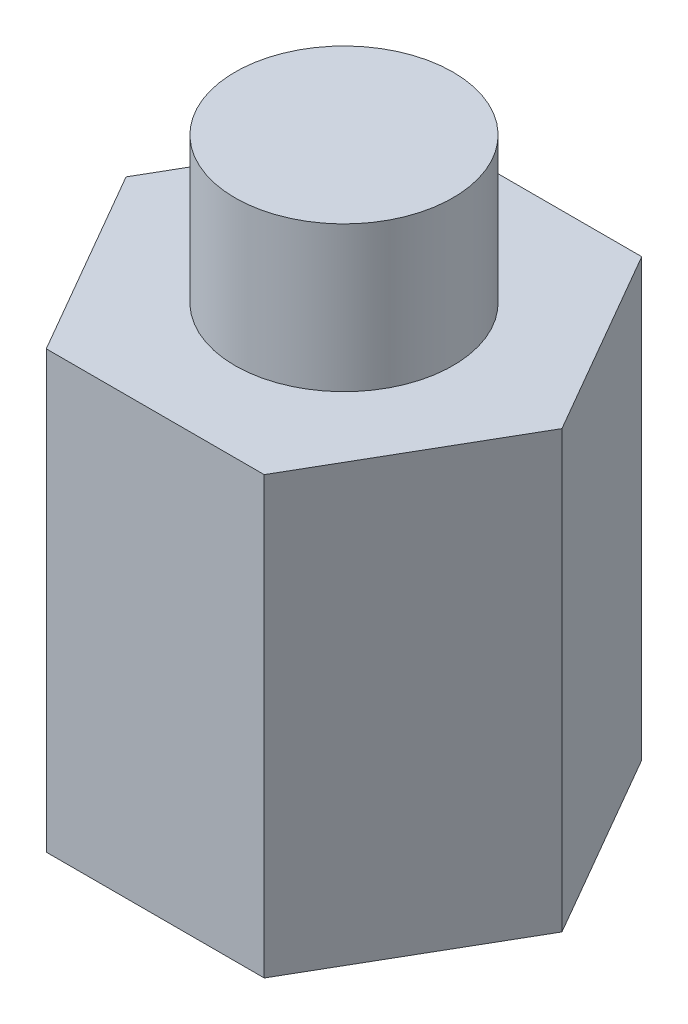
ISO-10303-21;
HEADER;
FILE_DESCRIPTION(('STEP AP214'),'2;1');
FILE_NAME('part.step','',(''),(''),'','','');
FILE_SCHEMA(('AUTOMOTIVE_DESIGN { 1 0 10303 214 1 1 1 1 }'));
ENDSEC;
DATA;
#1=APPLICATION_CONTEXT('core data for automotive mechanical design processes');
#2=APPLICATION_PROTOCOL_DEFINITION('international standard','automotive_design',2000,#1);
#3=PRODUCT_CONTEXT('',#1,'mechanical');
#4=PRODUCT('Part','Part','',(#3));
#5=PRODUCT_RELATED_PRODUCT_CATEGORY('part','',(#4));
#6=PRODUCT_DEFINITION_FORMATION('','',#4);
#7=PRODUCT_DEFINITION_CONTEXT('part definition',#1,'design');
#8=PRODUCT_DEFINITION('design','',#6,#7);
#9=PRODUCT_DEFINITION_SHAPE('','',#8);
#10=(LENGTH_UNIT() NAMED_UNIT(*) SI_UNIT(.MILLI.,.METRE.));
#11=(NAMED_UNIT(*) PLANE_ANGLE_UNIT() SI_UNIT($,.RADIAN.));
#12=(NAMED_UNIT(*) SI_UNIT($,.STERADIAN.) SOLID_ANGLE_UNIT());
#13=UNCERTAINTY_MEASURE_WITH_UNIT(LENGTH_MEASURE(1.E-05),#10,'distance_accuracy_value','');
#14=(GEOMETRIC_REPRESENTATION_CONTEXT(3) GLOBAL_UNCERTAINTY_ASSIGNED_CONTEXT((#13)) GLOBAL_UNIT_ASSIGNED_CONTEXT((#10,
#11,#12)) REPRESENTATION_CONTEXT('',''));
#15=CARTESIAN_POINT('',(0.,0.,0.));
#16=DIRECTION('',(0.,0.,1.));
#17=DIRECTION('',(1.,0.,0.));
#18=AXIS2_PLACEMENT_3D('',#15,#16,#17);
#19=CARTESIAN_POINT('',(0.,6.,0.));
#20=DIRECTION('',(0.,-1.,0.));
#21=DIRECTION('',(0.,0.,-1.));
#22=AXIS2_PLACEMENT_3D('',#19,#20,#21);
#23=CYLINDRICAL_SURFACE('',#22,1.5);
#24=CARTESIAN_POINT('',(0.,0.,0.));
#25=DIRECTION('',(0.,1.,0.));
#26=DIRECTION('',(0.,0.,1.));
#27=AXIS2_PLACEMENT_3D('',#24,#25,#26);
#28=CIRCLE('',#27,1.5);
#29=CARTESIAN_POINT('',(0.,0.,1.5));
#30=VERTEX_POINT('',#29);
#31=EDGE_CURVE('E262',#30,#30,#28,.T.);
#32=ORIENTED_EDGE('',*,*,#31,.F.);
#33=EDGE_LOOP('',(#32));
#34=FACE_BOUND('',#33,.T.);
#35=CARTESIAN_POINT('',(0.,5.,0.));
#36=DIRECTION('',(0.,1.,0.));
#37=DIRECTION('',(0.,0.,1.));
#38=AXIS2_PLACEMENT_3D('',#35,#36,#37);
#39=CIRCLE('',#38,1.5);
#40=CARTESIAN_POINT('',(0.,5.,1.5));
#41=VERTEX_POINT('',#40);
#42=EDGE_CURVE('E258',#41,#41,#39,.T.);
#43=ORIENTED_EDGE('',*,*,#42,.T.);
#44=EDGE_LOOP('',(#43));
#45=FACE_BOUND('',#44,.T.);
#46=ADVANCED_FACE('F45',(#34,#45),#23,.F.);
#47=CARTESIAN_POINT('',(0.,6.,0.));
#48=DIRECTION('',(0.,1.,0.));
#49=DIRECTION('',(0.,0.,1.));
#50=AXIS2_PLACEMENT_3D('',#47,#48,#49);
#51=PLANE('',#50);
#52=DIRECTION('',(0.5,0.,-0.866025403784439));
#53=VECTOR('',#52,1.);
#54=CARTESIAN_POINT('',(1.5,6.,2.59807621135332));
#55=LINE('',#54,#53);
#56=CARTESIAN_POINT('',(1.5,6.,2.59807621135332));
#57=VERTEX_POINT('',#56);
#58=CARTESIAN_POINT('',(3.,6.,0.));
#59=VERTEX_POINT('',#58);
#60=EDGE_CURVE('E153',#57,#59,#55,.T.);
#61=ORIENTED_EDGE('',*,*,#60,.T.);
#62=DIRECTION('',(-0.5,0.,-0.866025403784438));
#63=VECTOR('',#62,1.);
#64=CARTESIAN_POINT('',(3.,6.,0.));
#65=LINE('',#64,#63);
#66=CARTESIAN_POINT('',(1.5,6.,-2.59807621135331));
#67=VERTEX_POINT('',#66);
#68=EDGE_CURVE('E100',#59,#67,#65,.T.);
#69=ORIENTED_EDGE('',*,*,#68,.T.);
#70=DIRECTION('',(-1.,0.,0.));
#71=VECTOR('',#70,1.);
#72=CARTESIAN_POINT('',(1.5,6.,-2.59807621135331));
#73=LINE('',#72,#71);
#74=CARTESIAN_POINT('',(-1.5,6.,-2.59807621135332));
#75=VERTEX_POINT('',#74);
#76=EDGE_CURVE('E114',#67,#75,#73,.T.);
#77=ORIENTED_EDGE('',*,*,#76,.T.);
#78=DIRECTION('',(-0.5,0.,0.866025403784439));
#79=VECTOR('',#78,1.);
#80=CARTESIAN_POINT('',(-1.5,6.,-2.59807621135332));
#81=LINE('',#80,#79);
#82=CARTESIAN_POINT('',(-3.,6.,0.));
#83=VERTEX_POINT('',#82);
#84=EDGE_CURVE('E107',#75,#83,#81,.T.);
#85=ORIENTED_EDGE('',*,*,#84,.T.);
#86=DIRECTION('',(0.5,0.,0.866025403784439));
#87=VECTOR('',#86,1.);
#88=CARTESIAN_POINT('',(-3.,6.,0.));
#89=LINE('',#88,#87);
#90=CARTESIAN_POINT('',(-1.5,6.,2.59807621135332));
#91=VERTEX_POINT('',#90);
#92=EDGE_CURVE('E112',#83,#91,#89,.T.);
#93=ORIENTED_EDGE('',*,*,#92,.T.);
#94=DIRECTION('',(1.,0.,0.));
#95=VECTOR('',#94,1.);
#96=CARTESIAN_POINT('',(-1.5,6.,2.59807621135332));
#97=LINE('',#96,#95);
#98=EDGE_CURVE('E63',#91,#57,#97,.T.);
#99=ORIENTED_EDGE('',*,*,#98,.T.);
#100=EDGE_LOOP('',(#61,#69,#77,#85,#93,#99));
#101=FACE_BOUND('',#100,.T.);
#102=CARTESIAN_POINT('',(0.,6.,0.));
#103=DIRECTION('',(0.,1.,0.));
#104=DIRECTION('',(0.,0.,1.));
#105=AXIS2_PLACEMENT_3D('',#102,#103,#104);
#106=CIRCLE('',#105,1.5);
#107=CARTESIAN_POINT('',(0.,6.,1.5));
#108=VERTEX_POINT('',#107);
#109=EDGE_CURVE('E141',#108,#108,#106,.T.);
#110=ORIENTED_EDGE('',*,*,#109,.F.);
#111=EDGE_LOOP('',(#110));
#112=FACE_BOUND('',#111,.T.);
#113=ADVANCED_FACE('F109',(#101,#112),#51,.T.);
#114=CARTESIAN_POINT('',(0.,0.,0.));
#115=DIRECTION('',(0.,1.,0.));
#116=DIRECTION('',(0.,0.,1.));
#117=AXIS2_PLACEMENT_3D('',#114,#115,#116);
#118=PLANE('',#117);
#119=DIRECTION('',(0.5,0.,-0.866025403784439));
#120=VECTOR('',#119,1.);
#121=CARTESIAN_POINT('',(1.5,0.,2.59807621135332));
#122=LINE('',#121,#120);
#123=CARTESIAN_POINT('',(1.5,0.,2.59807621135332));
#124=VERTEX_POINT('',#123);
#125=CARTESIAN_POINT('',(3.,0.,0.));
#126=VERTEX_POINT('',#125);
#127=EDGE_CURVE('E136',#124,#126,#122,.T.);
#128=ORIENTED_EDGE('',*,*,#127,.F.);
#129=DIRECTION('',(1.,0.,0.));
#130=VECTOR('',#129,1.);
#131=CARTESIAN_POINT('',(-1.5,0.,2.59807621135332));
#132=LINE('',#131,#130);
#133=CARTESIAN_POINT('',(-1.5,0.,2.59807621135332));
#134=VERTEX_POINT('',#133);
#135=EDGE_CURVE('E92',#134,#124,#132,.T.);
#136=ORIENTED_EDGE('',*,*,#135,.F.);
#137=DIRECTION('',(0.5,0.,0.866025403784439));
#138=VECTOR('',#137,1.);
#139=CARTESIAN_POINT('',(-3.,0.,0.));
#140=LINE('',#139,#138);
#141=CARTESIAN_POINT('',(-3.,0.,0.));
#142=VERTEX_POINT('',#141);
#143=EDGE_CURVE('E86',#142,#134,#140,.T.);
#144=ORIENTED_EDGE('',*,*,#143,.F.);
#145=DIRECTION('',(-0.5,0.,0.866025403784439));
#146=VECTOR('',#145,1.);
#147=CARTESIAN_POINT('',(-1.5,0.,-2.59807621135332));
#148=LINE('',#147,#146);
#149=CARTESIAN_POINT('',(-1.5,0.,-2.59807621135332));
#150=VERTEX_POINT('',#149);
#151=EDGE_CURVE('E123',#150,#142,#148,.T.);
#152=ORIENTED_EDGE('',*,*,#151,.F.);
#153=DIRECTION('',(-1.,0.,0.));
#154=VECTOR('',#153,1.);
#155=CARTESIAN_POINT('',(1.5,0.,-2.59807621135331));
#156=LINE('',#155,#154);
#157=CARTESIAN_POINT('',(1.5,0.,-2.59807621135331));
#158=VERTEX_POINT('',#157);
#159=EDGE_CURVE('E144',#158,#150,#156,.T.);
#160=ORIENTED_EDGE('',*,*,#159,.F.);
#161=DIRECTION('',(-0.5,0.,-0.866025403784438));
#162=VECTOR('',#161,1.);
#163=CARTESIAN_POINT('',(3.,0.,0.));
#164=LINE('',#163,#162);
#165=EDGE_CURVE('E140',#126,#158,#164,.T.);
#166=ORIENTED_EDGE('',*,*,#165,.F.);
#167=EDGE_LOOP('',(#128,#136,#144,#152,#160,#166));
#168=FACE_BOUND('',#167,.T.);
#169=ORIENTED_EDGE('',*,*,#31,.T.);
#170=EDGE_LOOP('',(#169));
#171=FACE_BOUND('',#170,.T.);
#172=ADVANCED_FACE('F166',(#168,#171),#118,.F.);
#173=CARTESIAN_POINT('',(1.5,6.,2.59807621135332));
#174=DIRECTION('',(-0.866025403784439,0.,-0.499999999999999));
#175=DIRECTION('',(-0.5,0.,0.866025403784439));
#176=AXIS2_PLACEMENT_3D('',#173,#174,#175);
#177=PLANE('',#176);
#178=ORIENTED_EDGE('',*,*,#127,.T.);
#179=DIRECTION('',(0.,-1.,0.));
#180=VECTOR('',#179,1.);
#181=CARTESIAN_POINT('',(3.,6.,0.));
#182=LINE('',#181,#180);
#183=EDGE_CURVE('E11',#59,#126,#182,.T.);
#184=ORIENTED_EDGE('',*,*,#183,.F.);
#185=ORIENTED_EDGE('',*,*,#60,.F.);
#186=DIRECTION('',(0.,-1.,0.));
#187=VECTOR('',#186,1.);
#188=CARTESIAN_POINT('',(1.5,6.,2.59807621135332));
#189=LINE('',#188,#187);
#190=EDGE_CURVE('E132',#57,#124,#189,.T.);
#191=ORIENTED_EDGE('',*,*,#190,.T.);
#192=EDGE_LOOP('',(#178,#184,#185,#191));
#193=FACE_BOUND('',#192,.T.);
#194=ADVANCED_FACE('F47',(#193),#177,.F.);
#195=CARTESIAN_POINT('',(3.,6.,0.));
#196=DIRECTION('',(-0.866025403784439,0.,0.5));
#197=DIRECTION('',(0.5,0.,0.866025403784439));
#198=AXIS2_PLACEMENT_3D('',#195,#196,#197);
#199=PLANE('',#198);
#200=ORIENTED_EDGE('',*,*,#165,.T.);
#201=DIRECTION('',(0.,-1.,0.));
#202=VECTOR('',#201,1.);
#203=CARTESIAN_POINT('',(1.5,6.,-2.59807621135331));
#204=LINE('',#203,#202);
#205=EDGE_CURVE('E55',#67,#158,#204,.T.);
#206=ORIENTED_EDGE('',*,*,#205,.F.);
#207=ORIENTED_EDGE('',*,*,#68,.F.);
#208=ORIENTED_EDGE('',*,*,#183,.T.);
#209=EDGE_LOOP('',(#200,#206,#207,#208));
#210=FACE_BOUND('',#209,.T.);
#211=ADVANCED_FACE('F198',(#210),#199,.F.);
#212=CARTESIAN_POINT('',(1.5,6.,-2.59807621135331));
#213=DIRECTION('',(0.,0.,1.));
#214=DIRECTION('',(1.,0.,0.));
#215=AXIS2_PLACEMENT_3D('',#212,#213,#214);
#216=PLANE('',#215);
#217=ORIENTED_EDGE('',*,*,#159,.T.);
#218=DIRECTION('',(0.,-1.,0.));
#219=VECTOR('',#218,1.);
#220=CARTESIAN_POINT('',(-1.5,6.,-2.59807621135332));
#221=LINE('',#220,#219);
#222=EDGE_CURVE('E125',#75,#150,#221,.T.);
#223=ORIENTED_EDGE('',*,*,#222,.F.);
#224=ORIENTED_EDGE('',*,*,#76,.F.);
#225=ORIENTED_EDGE('',*,*,#205,.T.);
#226=EDGE_LOOP('',(#217,#223,#224,#225));
#227=FACE_BOUND('',#226,.T.);
#228=ADVANCED_FACE('F163',(#227),#216,.F.);
#229=CARTESIAN_POINT('',(-1.5,6.,-2.59807621135332));
#230=DIRECTION('',(0.866025403784439,0.,0.5));
#231=DIRECTION('',(0.5,0.,-0.866025403784439));
#232=AXIS2_PLACEMENT_3D('',#229,#230,#231);
#233=PLANE('',#232);
#234=ORIENTED_EDGE('',*,*,#151,.T.);
#235=DIRECTION('',(0.,-1.,0.));
#236=VECTOR('',#235,1.);
#237=CARTESIAN_POINT('',(-3.,6.,0.));
#238=LINE('',#237,#236);
#239=EDGE_CURVE('E120',#83,#142,#238,.T.);
#240=ORIENTED_EDGE('',*,*,#239,.F.);
#241=ORIENTED_EDGE('',*,*,#84,.F.);
#242=ORIENTED_EDGE('',*,*,#222,.T.);
#243=EDGE_LOOP('',(#234,#240,#241,#242));
#244=FACE_BOUND('',#243,.T.);
#245=ADVANCED_FACE('F121',(#244),#233,.F.);
#246=CARTESIAN_POINT('',(-3.,6.,0.));
#247=DIRECTION('',(0.866025403784438,0.,-0.5));
#248=DIRECTION('',(-0.5,0.,-0.866025403784439));
#249=AXIS2_PLACEMENT_3D('',#246,#247,#248);
#250=PLANE('',#249);
#251=ORIENTED_EDGE('',*,*,#143,.T.);
#252=DIRECTION('',(0.,-1.,0.));
#253=VECTOR('',#252,1.);
#254=CARTESIAN_POINT('',(-1.5,6.,2.59807621135332));
#255=LINE('',#254,#253);
#256=EDGE_CURVE('E126',#91,#134,#255,.T.);
#257=ORIENTED_EDGE('',*,*,#256,.F.);
#258=ORIENTED_EDGE('',*,*,#92,.F.);
#259=ORIENTED_EDGE('',*,*,#239,.T.);
#260=EDGE_LOOP('',(#251,#257,#258,#259));
#261=FACE_BOUND('',#260,.T.);
#262=ADVANCED_FACE('F128',(#261),#250,.F.);
#263=CARTESIAN_POINT('',(-1.5,6.,2.59807621135332));
#264=DIRECTION('',(0.,0.,-1.));
#265=DIRECTION('',(-1.,0.,0.));
#266=AXIS2_PLACEMENT_3D('',#263,#264,#265);
#267=PLANE('',#266);
#268=ORIENTED_EDGE('',*,*,#135,.T.);
#269=ORIENTED_EDGE('',*,*,#190,.F.);
#270=ORIENTED_EDGE('',*,*,#98,.F.);
#271=ORIENTED_EDGE('',*,*,#256,.T.);
#272=EDGE_LOOP('',(#268,#269,#270,#271));
#273=FACE_BOUND('',#272,.T.);
#274=ADVANCED_FACE('F171',(#273),#267,.F.);
#275=CARTESIAN_POINT('',(0.,5.,0.));
#276=DIRECTION('',(0.,1.,0.));
#277=DIRECTION('',(0.,0.,1.));
#278=AXIS2_PLACEMENT_3D('',#275,#276,#277);
#279=PLANE('',#278);
#280=ORIENTED_EDGE('',*,*,#42,.F.);
#281=EDGE_LOOP('',(#280));
#282=FACE_BOUND('',#281,.T.);
#283=ADVANCED_FACE('F173',(#282),#279,.F.);
#284=CARTESIAN_POINT('',(0.,5.,0.));
#285=DIRECTION('',(0.,1.,0.));
#286=DIRECTION('',(0.,0.,1.));
#287=AXIS2_PLACEMENT_3D('',#284,#285,#286);
#288=CYLINDRICAL_SURFACE('',#287,1.5);
#289=ORIENTED_EDGE('',*,*,#109,.T.);
#290=EDGE_LOOP('',(#289));
#291=FACE_BOUND('',#290,.T.);
#292=CARTESIAN_POINT('',(0.,8.,0.));
#293=DIRECTION('',(0.,1.,0.));
#294=DIRECTION('',(0.,0.,1.));
#295=AXIS2_PLACEMENT_3D('',#292,#293,#294);
#296=CIRCLE('',#295,1.5);
#297=CARTESIAN_POINT('',(0.,8.,1.5));
#298=VERTEX_POINT('',#297);
#299=EDGE_CURVE('E255',#298,#298,#296,.T.);
#300=ORIENTED_EDGE('',*,*,#299,.F.);
#301=EDGE_LOOP('',(#300));
#302=FACE_BOUND('',#301,.T.);
#303=ADVANCED_FACE('F180',(#291,#302),#288,.T.);
#304=CARTESIAN_POINT('',(0.,8.,0.));
#305=DIRECTION('',(0.,1.,0.));
#306=DIRECTION('',(0.,0.,1.));
#307=AXIS2_PLACEMENT_3D('',#304,#305,#306);
#308=PLANE('',#307);
#309=ORIENTED_EDGE('',*,*,#299,.T.);
#310=EDGE_LOOP('',(#309));
#311=FACE_BOUND('',#310,.T.);
#312=ADVANCED_FACE('F241',(#311),#308,.T.);
#313=CLOSED_SHELL('',(#46,#113,#172,#194,#211,#228,#245,#262,#274,#283,#303,#312));
#314=MANIFOLD_SOLID_BREP('B2',#313);
#315=ADVANCED_BREP_SHAPE_REPRESENTATION('',(#18,#314),#14);
#316=SHAPE_DEFINITION_REPRESENTATION(#9,#315);
ENDSEC;
END-ISO-10303-21;
